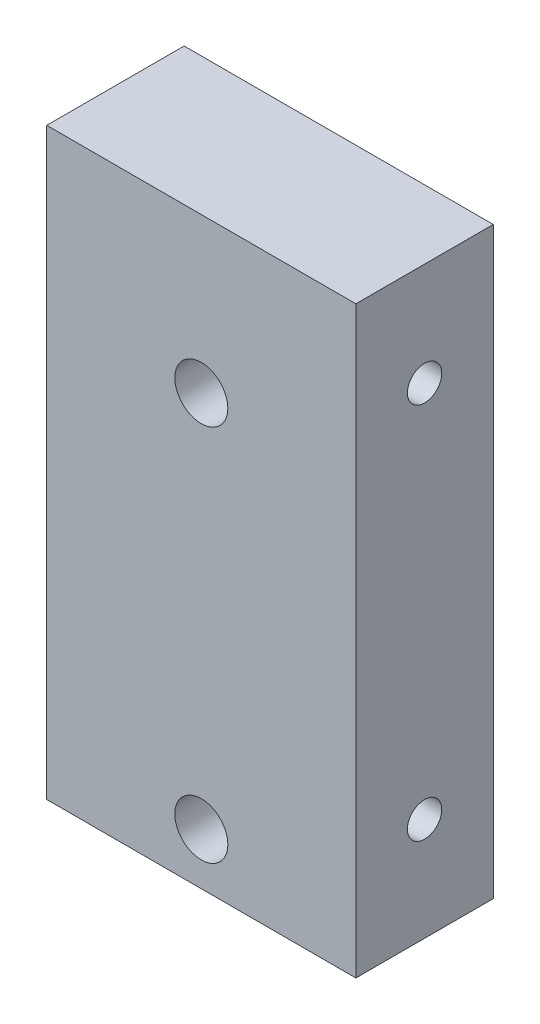
ISO-10303-21;
HEADER;
FILE_DESCRIPTION(('STEP AP214'),'2;1');
FILE_NAME('part.step','',(''),(''),'','','');
FILE_SCHEMA(('AUTOMOTIVE_DESIGN { 1 0 10303 214 1 1 1 1 }'));
ENDSEC;
DATA;
#1=APPLICATION_CONTEXT('core data for automotive mechanical design processes');
#2=APPLICATION_PROTOCOL_DEFINITION('international standard','automotive_design',2000,#1);
#3=PRODUCT_CONTEXT('',#1,'mechanical');
#4=PRODUCT('Part','Part','',(#3));
#5=PRODUCT_RELATED_PRODUCT_CATEGORY('part','',(#4));
#6=PRODUCT_DEFINITION_FORMATION('','',#4);
#7=PRODUCT_DEFINITION_CONTEXT('part definition',#1,'design');
#8=PRODUCT_DEFINITION('design','',#6,#7);
#9=PRODUCT_DEFINITION_SHAPE('','',#8);
#10=(LENGTH_UNIT() NAMED_UNIT(*) SI_UNIT(.MILLI.,.METRE.));
#11=(NAMED_UNIT(*) PLANE_ANGLE_UNIT() SI_UNIT($,.RADIAN.));
#12=(NAMED_UNIT(*) SI_UNIT($,.STERADIAN.) SOLID_ANGLE_UNIT());
#13=UNCERTAINTY_MEASURE_WITH_UNIT(LENGTH_MEASURE(1.E-05),#10,'distance_accuracy_value','');
#14=(GEOMETRIC_REPRESENTATION_CONTEXT(3) GLOBAL_UNCERTAINTY_ASSIGNED_CONTEXT((#13)) GLOBAL_UNIT_ASSIGNED_CONTEXT((#10,
#11,#12)) REPRESENTATION_CONTEXT('',''));
#15=CARTESIAN_POINT('',(0.,0.,0.));
#16=DIRECTION('',(0.,0.,1.));
#17=DIRECTION('',(1.,0.,0.));
#18=AXIS2_PLACEMENT_3D('',#15,#16,#17);
#19=CARTESIAN_POINT('',(-28.575,53.975,12.7));
#20=DIRECTION('',(0.,0.,-1.));
#21=DIRECTION('',(-1.,0.,0.));
#22=AXIS2_PLACEMENT_3D('',#19,#20,#21);
#23=PLANE('',#22);
#24=DIRECTION('',(1.,0.,0.));
#25=VECTOR('',#24,1.);
#26=CARTESIAN_POINT('',(-28.575,-53.975,12.7));
#27=LINE('',#26,#25);
#28=CARTESIAN_POINT('',(-28.575,-53.975,12.7));
#29=VERTEX_POINT('',#28);
#30=CARTESIAN_POINT('',(28.575,-53.975,12.7));
#31=VERTEX_POINT('',#30);
#32=EDGE_CURVE('E81',#29,#31,#27,.T.);
#33=ORIENTED_EDGE('',*,*,#32,.T.);
#34=DIRECTION('',(0.,-1.,0.));
#35=VECTOR('',#34,1.);
#36=CARTESIAN_POINT('',(28.575,53.975,12.7));
#37=LINE('',#36,#35);
#38=CARTESIAN_POINT('',(28.575,53.975,12.7));
#39=VERTEX_POINT('',#38);
#40=EDGE_CURVE('E101',#39,#31,#37,.T.);
#41=ORIENTED_EDGE('',*,*,#40,.F.);
#42=DIRECTION('',(1.,0.,0.));
#43=VECTOR('',#42,1.);
#44=CARTESIAN_POINT('',(-28.575,53.975,12.7));
#45=LINE('',#44,#43);
#46=CARTESIAN_POINT('',(-28.575,53.975,12.7));
#47=VERTEX_POINT('',#46);
#48=EDGE_CURVE('E57',#47,#39,#45,.T.);
#49=ORIENTED_EDGE('',*,*,#48,.F.);
#50=DIRECTION('',(0.,-1.,0.));
#51=VECTOR('',#50,1.);
#52=CARTESIAN_POINT('',(-28.575,53.975,12.7));
#53=LINE('',#52,#51);
#54=EDGE_CURVE('E98',#47,#29,#53,.T.);
#55=ORIENTED_EDGE('',*,*,#54,.T.);
#56=EDGE_LOOP('',(#33,#41,#49,#55));
#57=FACE_BOUND('',#56,.T.);
#58=CARTESIAN_POINT('',(0.,25.4,12.7));
#59=DIRECTION('',(0.,0.,1.));
#60=DIRECTION('',(1.,0.,0.));
#61=AXIS2_PLACEMENT_3D('',#58,#59,#60);
#62=CIRCLE('',#61,4.9022);
#63=CARTESIAN_POINT('',(4.9022,25.4,12.7));
#64=VERTEX_POINT('',#63);
#65=EDGE_CURVE('E139',#64,#64,#62,.T.);
#66=ORIENTED_EDGE('',*,*,#65,.F.);
#67=EDGE_LOOP('',(#66));
#68=FACE_BOUND('',#67,.T.);
#69=CARTESIAN_POINT('',(0.,-44.45,12.7));
#70=DIRECTION('',(0.,0.,1.));
#71=DIRECTION('',(1.,0.,0.));
#72=AXIS2_PLACEMENT_3D('',#69,#70,#71);
#73=CIRCLE('',#72,4.9022);
#74=CARTESIAN_POINT('',(4.9022,-44.45,12.7));
#75=VERTEX_POINT('',#74);
#76=EDGE_CURVE('E145',#75,#75,#73,.T.);
#77=ORIENTED_EDGE('',*,*,#76,.F.);
#78=EDGE_LOOP('',(#77));
#79=FACE_BOUND('',#78,.T.);
#80=ADVANCED_FACE('F40',(#57,#68,#79),#23,.F.);
#81=CARTESIAN_POINT('',(28.575,53.975,12.7));
#82=DIRECTION('',(-1.,0.,0.));
#83=DIRECTION('',(0.,0.,1.));
#84=AXIS2_PLACEMENT_3D('',#81,#82,#83);
#85=PLANE('',#84);
#86=CARTESIAN_POINT('',(28.575,-34.925,0.));
#87=DIRECTION('',(1.,0.,0.));
#88=DIRECTION('',(0.,0.,-1.));
#89=AXIS2_PLACEMENT_3D('',#86,#87,#88);
#90=CIRCLE('',#89,3.17499999999998);
#91=CARTESIAN_POINT('',(28.575,-34.925,-3.17499999999998));
#92=VERTEX_POINT('',#91);
#93=EDGE_CURVE('E133',#92,#92,#90,.T.);
#94=ORIENTED_EDGE('',*,*,#93,.F.);
#95=EDGE_LOOP('',(#94));
#96=FACE_BOUND('',#95,.T.);
#97=CARTESIAN_POINT('',(28.575,34.925,0.));
#98=DIRECTION('',(1.,0.,0.));
#99=DIRECTION('',(0.,0.,-1.));
#100=AXIS2_PLACEMENT_3D('',#97,#98,#99);
#101=CIRCLE('',#100,3.17499999999998);
#102=CARTESIAN_POINT('',(28.575,34.925,-3.17499999999998));
#103=VERTEX_POINT('',#102);
#104=EDGE_CURVE('E127',#103,#103,#101,.T.);
#105=ORIENTED_EDGE('',*,*,#104,.F.);
#106=EDGE_LOOP('',(#105));
#107=FACE_BOUND('',#106,.T.);
#108=DIRECTION('',(0.,0.,-1.));
#109=VECTOR('',#108,1.);
#110=CARTESIAN_POINT('',(28.575,-53.975,12.7));
#111=LINE('',#110,#109);
#112=CARTESIAN_POINT('',(28.575,-53.975,-12.7));
#113=VERTEX_POINT('',#112);
#114=EDGE_CURVE('E105',#31,#113,#111,.T.);
#115=ORIENTED_EDGE('',*,*,#114,.T.);
#116=DIRECTION('',(0.,-1.,0.));
#117=VECTOR('',#116,1.);
#118=CARTESIAN_POINT('',(28.575,53.975,-12.7));
#119=LINE('',#118,#117);
#120=CARTESIAN_POINT('',(28.575,53.975,-12.7));
#121=VERTEX_POINT('',#120);
#122=EDGE_CURVE('E11',#121,#113,#119,.T.);
#123=ORIENTED_EDGE('',*,*,#122,.F.);
#124=DIRECTION('',(0.,0.,-1.));
#125=VECTOR('',#124,1.);
#126=CARTESIAN_POINT('',(28.575,53.975,12.7));
#127=LINE('',#126,#125);
#128=EDGE_CURVE('E93',#39,#121,#127,.T.);
#129=ORIENTED_EDGE('',*,*,#128,.F.);
#130=ORIENTED_EDGE('',*,*,#40,.T.);
#131=EDGE_LOOP('',(#115,#123,#129,#130));
#132=FACE_BOUND('',#131,.T.);
#133=ADVANCED_FACE('F42',(#96,#107,#132),#85,.F.);
#134=CARTESIAN_POINT('',(-28.575,53.975,-12.7));
#135=DIRECTION('',(0.,0.,1.));
#136=DIRECTION('',(1.,0.,0.));
#137=AXIS2_PLACEMENT_3D('',#134,#135,#136);
#138=PLANE('',#137);
#139=CARTESIAN_POINT('',(0.,-44.45,-12.7));
#140=DIRECTION('',(0.,0.,1.));
#141=DIRECTION('',(1.,0.,0.));
#142=AXIS2_PLACEMENT_3D('',#139,#140,#141);
#143=CIRCLE('',#142,4.9022);
#144=CARTESIAN_POINT('',(4.9022,-44.45,-12.7));
#145=VERTEX_POINT('',#144);
#146=EDGE_CURVE('E142',#145,#145,#143,.T.);
#147=ORIENTED_EDGE('',*,*,#146,.T.);
#148=EDGE_LOOP('',(#147));
#149=FACE_BOUND('',#148,.T.);
#150=CARTESIAN_POINT('',(0.,25.4,-12.7));
#151=DIRECTION('',(0.,0.,1.));
#152=DIRECTION('',(1.,0.,0.));
#153=AXIS2_PLACEMENT_3D('',#150,#151,#152);
#154=CIRCLE('',#153,4.9022);
#155=CARTESIAN_POINT('',(4.9022,25.4,-12.7));
#156=VERTEX_POINT('',#155);
#157=EDGE_CURVE('E136',#156,#156,#154,.T.);
#158=ORIENTED_EDGE('',*,*,#157,.T.);
#159=EDGE_LOOP('',(#158));
#160=FACE_BOUND('',#159,.T.);
#161=DIRECTION('',(-1.,0.,0.));
#162=VECTOR('',#161,1.);
#163=CARTESIAN_POINT('',(-28.575,-53.975,-12.7));
#164=LINE('',#163,#162);
#165=CARTESIAN_POINT('',(-28.575,-53.975,-12.7));
#166=VERTEX_POINT('',#165);
#167=EDGE_CURVE('E97',#113,#166,#164,.T.);
#168=ORIENTED_EDGE('',*,*,#167,.T.);
#169=DIRECTION('',(0.,-1.,0.));
#170=VECTOR('',#169,1.);
#171=CARTESIAN_POINT('',(-28.575,53.975,-12.7));
#172=LINE('',#171,#170);
#173=CARTESIAN_POINT('',(-28.575,53.975,-12.7));
#174=VERTEX_POINT('',#173);
#175=EDGE_CURVE('E49',#174,#166,#172,.T.);
#176=ORIENTED_EDGE('',*,*,#175,.F.);
#177=DIRECTION('',(-1.,0.,0.));
#178=VECTOR('',#177,1.);
#179=CARTESIAN_POINT('',(-28.575,53.975,-12.7));
#180=LINE('',#179,#178);
#181=EDGE_CURVE('E88',#121,#174,#180,.T.);
#182=ORIENTED_EDGE('',*,*,#181,.F.);
#183=ORIENTED_EDGE('',*,*,#122,.T.);
#184=EDGE_LOOP('',(#168,#176,#182,#183));
#185=FACE_BOUND('',#184,.T.);
#186=ADVANCED_FACE('F96',(#149,#160,#185),#138,.F.);
#187=CARTESIAN_POINT('',(-28.575,53.975,12.7));
#188=DIRECTION('',(1.,0.,0.));
#189=DIRECTION('',(0.,0.,-1.));
#190=AXIS2_PLACEMENT_3D('',#187,#188,#189);
#191=PLANE('',#190);
#192=CARTESIAN_POINT('',(-28.575,-34.925,0.));
#193=DIRECTION('',(1.,0.,0.));
#194=DIRECTION('',(0.,0.,-1.));
#195=AXIS2_PLACEMENT_3D('',#192,#193,#194);
#196=CIRCLE('',#195,3.17499999999998);
#197=CARTESIAN_POINT('',(-28.575,-34.925,-3.17499999999998));
#198=VERTEX_POINT('',#197);
#199=EDGE_CURVE('E130',#198,#198,#196,.T.);
#200=ORIENTED_EDGE('',*,*,#199,.T.);
#201=EDGE_LOOP('',(#200));
#202=FACE_BOUND('',#201,.T.);
#203=CARTESIAN_POINT('',(-28.575,34.925,0.));
#204=DIRECTION('',(1.,0.,0.));
#205=DIRECTION('',(0.,0.,-1.));
#206=AXIS2_PLACEMENT_3D('',#203,#204,#205);
#207=CIRCLE('',#206,3.17499999999998);
#208=CARTESIAN_POINT('',(-28.575,34.925,-3.17499999999998));
#209=VERTEX_POINT('',#208);
#210=EDGE_CURVE('E108',#209,#209,#207,.T.);
#211=ORIENTED_EDGE('',*,*,#210,.T.);
#212=EDGE_LOOP('',(#211));
#213=FACE_BOUND('',#212,.T.);
#214=DIRECTION('',(0.,0.,1.));
#215=VECTOR('',#214,1.);
#216=CARTESIAN_POINT('',(-28.575,-53.975,12.7));
#217=LINE('',#216,#215);
#218=EDGE_CURVE('E75',#166,#29,#217,.T.);
#219=ORIENTED_EDGE('',*,*,#218,.T.);
#220=ORIENTED_EDGE('',*,*,#54,.F.);
#221=DIRECTION('',(0.,0.,1.));
#222=VECTOR('',#221,1.);
#223=CARTESIAN_POINT('',(-28.575,53.975,12.7));
#224=LINE('',#223,#222);
#225=EDGE_CURVE('E91',#174,#47,#224,.T.);
#226=ORIENTED_EDGE('',*,*,#225,.F.);
#227=ORIENTED_EDGE('',*,*,#175,.T.);
#228=EDGE_LOOP('',(#219,#220,#226,#227));
#229=FACE_BOUND('',#228,.T.);
#230=ADVANCED_FACE('F99',(#202,#213,#229),#191,.F.);
#231=CARTESIAN_POINT('',(0.,53.975,0.));
#232=DIRECTION('',(0.,-1.,0.));
#233=DIRECTION('',(0.,0.,-1.));
#234=AXIS2_PLACEMENT_3D('',#231,#232,#233);
#235=PLANE('',#234);
#236=ORIENTED_EDGE('',*,*,#128,.T.);
#237=ORIENTED_EDGE('',*,*,#181,.T.);
#238=ORIENTED_EDGE('',*,*,#225,.T.);
#239=ORIENTED_EDGE('',*,*,#48,.T.);
#240=EDGE_LOOP('',(#236,#237,#238,#239));
#241=FACE_BOUND('',#240,.T.);
#242=ADVANCED_FACE('F89',(#241),#235,.F.);
#243=CARTESIAN_POINT('',(0.,-53.975,0.));
#244=DIRECTION('',(0.,-1.,0.));
#245=DIRECTION('',(0.,0.,-1.));
#246=AXIS2_PLACEMENT_3D('',#243,#244,#245);
#247=PLANE('',#246);
#248=ORIENTED_EDGE('',*,*,#114,.F.);
#249=ORIENTED_EDGE('',*,*,#32,.F.);
#250=ORIENTED_EDGE('',*,*,#218,.F.);
#251=ORIENTED_EDGE('',*,*,#167,.F.);
#252=EDGE_LOOP('',(#248,#249,#250,#251));
#253=FACE_BOUND('',#252,.T.);
#254=ADVANCED_FACE('F122',(#253),#247,.T.);
#255=CARTESIAN_POINT('',(28.575,34.925,0.));
#256=DIRECTION('',(1.,0.,0.));
#257=DIRECTION('',(0.,0.,-1.));
#258=AXIS2_PLACEMENT_3D('',#255,#256,#257);
#259=CYLINDRICAL_SURFACE('',#258,3.17499999999998);
#260=ORIENTED_EDGE('',*,*,#210,.F.);
#261=EDGE_LOOP('',(#260));
#262=FACE_BOUND('',#261,.T.);
#263=ORIENTED_EDGE('',*,*,#104,.T.);
#264=EDGE_LOOP('',(#263));
#265=FACE_BOUND('',#264,.T.);
#266=ADVANCED_FACE('F181',(#262,#265),#259,.F.);
#267=CARTESIAN_POINT('',(28.575,-34.925,0.));
#268=DIRECTION('',(1.,0.,0.));
#269=DIRECTION('',(0.,0.,-1.));
#270=AXIS2_PLACEMENT_3D('',#267,#268,#269);
#271=CYLINDRICAL_SURFACE('',#270,3.17499999999998);
#272=ORIENTED_EDGE('',*,*,#199,.F.);
#273=EDGE_LOOP('',(#272));
#274=FACE_BOUND('',#273,.T.);
#275=ORIENTED_EDGE('',*,*,#93,.T.);
#276=EDGE_LOOP('',(#275));
#277=FACE_BOUND('',#276,.T.);
#278=ADVANCED_FACE('F172',(#274,#277),#271,.F.);
#279=CARTESIAN_POINT('',(0.,25.4,12.7));
#280=DIRECTION('',(0.,0.,1.));
#281=DIRECTION('',(1.,0.,0.));
#282=AXIS2_PLACEMENT_3D('',#279,#280,#281);
#283=CYLINDRICAL_SURFACE('',#282,4.9022);
#284=ORIENTED_EDGE('',*,*,#157,.F.);
#285=EDGE_LOOP('',(#284));
#286=FACE_BOUND('',#285,.T.);
#287=ORIENTED_EDGE('',*,*,#65,.T.);
#288=EDGE_LOOP('',(#287));
#289=FACE_BOUND('',#288,.T.);
#290=ADVANCED_FACE('F169',(#286,#289),#283,.F.);
#291=CARTESIAN_POINT('',(0.,-44.45,12.7));
#292=DIRECTION('',(0.,0.,1.));
#293=DIRECTION('',(1.,0.,0.));
#294=AXIS2_PLACEMENT_3D('',#291,#292,#293);
#295=CYLINDRICAL_SURFACE('',#294,4.9022);
#296=ORIENTED_EDGE('',*,*,#146,.F.);
#297=EDGE_LOOP('',(#296));
#298=FACE_BOUND('',#297,.T.);
#299=ORIENTED_EDGE('',*,*,#76,.T.);
#300=EDGE_LOOP('',(#299));
#301=FACE_BOUND('',#300,.T.);
#302=ADVANCED_FACE('F149',(#298,#301),#295,.F.);
#303=CLOSED_SHELL('',(#80,#133,#186,#230,#242,#254,#266,#278,#290,#302));
#304=MANIFOLD_SOLID_BREP('B2',#303);
#305=ADVANCED_BREP_SHAPE_REPRESENTATION('',(#18,#304),#14);
#306=SHAPE_DEFINITION_REPRESENTATION(#9,#305);
ENDSEC;
END-ISO-10303-21;
